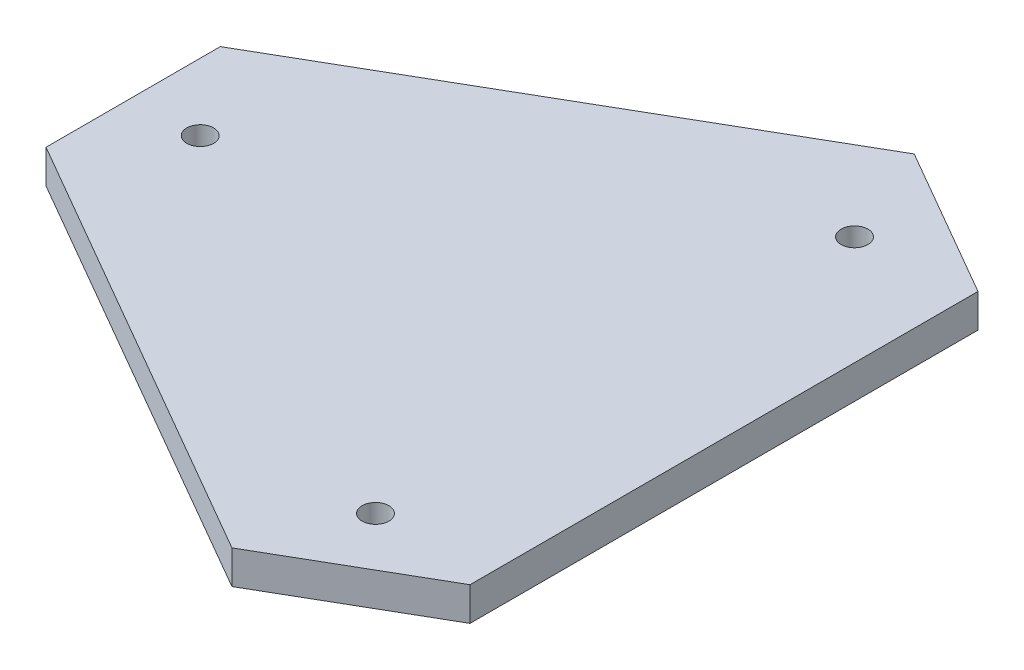
ISO-10303-21;
HEADER;
FILE_DESCRIPTION(('STEP AP214'),'2;1');
FILE_NAME('part.step','',(''),(''),'','','');
FILE_SCHEMA(('AUTOMOTIVE_DESIGN { 1 0 10303 214 1 1 1 1 }'));
ENDSEC;
DATA;
#1=APPLICATION_CONTEXT('core data for automotive mechanical design processes');
#2=APPLICATION_PROTOCOL_DEFINITION('international standard','automotive_design',2000,#1);
#3=PRODUCT_CONTEXT('',#1,'mechanical');
#4=PRODUCT('Part','Part','',(#3));
#5=PRODUCT_RELATED_PRODUCT_CATEGORY('part','',(#4));
#6=PRODUCT_DEFINITION_FORMATION('','',#4);
#7=PRODUCT_DEFINITION_CONTEXT('part definition',#1,'design');
#8=PRODUCT_DEFINITION('design','',#6,#7);
#9=PRODUCT_DEFINITION_SHAPE('','',#8);
#10=(LENGTH_UNIT() NAMED_UNIT(*) SI_UNIT(.MILLI.,.METRE.));
#11=(NAMED_UNIT(*) PLANE_ANGLE_UNIT() SI_UNIT($,.RADIAN.));
#12=(NAMED_UNIT(*) SI_UNIT($,.STERADIAN.) SOLID_ANGLE_UNIT());
#13=UNCERTAINTY_MEASURE_WITH_UNIT(LENGTH_MEASURE(1.E-05),#10,'distance_accuracy_value','');
#14=(GEOMETRIC_REPRESENTATION_CONTEXT(3) GLOBAL_UNCERTAINTY_ASSIGNED_CONTEXT((#13)) GLOBAL_UNIT_ASSIGNED_CONTEXT((#10,
#11,#12)) REPRESENTATION_CONTEXT('',''));
#15=CARTESIAN_POINT('',(0.,0.,0.));
#16=DIRECTION('',(0.,0.,1.));
#17=DIRECTION('',(1.,0.,0.));
#18=AXIS2_PLACEMENT_3D('',#15,#16,#17);
#19=CARTESIAN_POINT('',(-18.44216054185,5.,31.9427590598262));
#20=DIRECTION('',(-0.5,0.,0.866025403784439));
#21=DIRECTION('',(0.866025403784439,0.,0.5));
#22=AXIS2_PLACEMENT_3D('',#19,#20,#21);
#23=PLANE('',#22);
#24=DIRECTION('',(-0.866025403784439,0.,-0.5));
#25=VECTOR('',#24,1.);
#26=CARTESIAN_POINT('',(-18.44216054185,0.,31.9427590598262));
#27=LINE('',#26,#25);
#28=CARTESIAN_POINT('',(14.3676605853047,0.,50.8855181196525));
#29=VERTEX_POINT('',#28);
#30=CARTESIAN_POINT('',(-51.2519816690048,0.,13.));
#31=VERTEX_POINT('',#30);
#32=EDGE_CURVE('E142',#29,#31,#27,.T.);
#33=ORIENTED_EDGE('',*,*,#32,.F.);
#34=DIRECTION('',(0.,-1.,0.));
#35=VECTOR('',#34,1.);
#36=CARTESIAN_POINT('',(14.3676605853047,5.,50.8855181196525));
#37=LINE('',#36,#35);
#38=CARTESIAN_POINT('',(14.3676605853047,5.,50.8855181196525));
#39=VERTEX_POINT('',#38);
#40=EDGE_CURVE('E11',#39,#29,#37,.T.);
#41=ORIENTED_EDGE('',*,*,#40,.F.);
#42=DIRECTION('',(-0.866025403784439,0.,-0.5));
#43=VECTOR('',#42,1.);
#44=CARTESIAN_POINT('',(-18.44216054185,5.,31.9427590598262));
#45=LINE('',#44,#43);
#46=CARTESIAN_POINT('',(-51.2519816690048,5.,13.));
#47=VERTEX_POINT('',#46);
#48=EDGE_CURVE('E312',#39,#47,#45,.T.);
#49=ORIENTED_EDGE('',*,*,#48,.T.);
#50=DIRECTION('',(0.,-1.,0.));
#51=VECTOR('',#50,1.);
#52=CARTESIAN_POINT('',(-51.2519816690048,5.,13.));
#53=LINE('',#52,#51);
#54=EDGE_CURVE('E61',#47,#31,#53,.T.);
#55=ORIENTED_EDGE('',*,*,#54,.T.);
#56=EDGE_LOOP('',(#33,#41,#49,#55));
#57=FACE_BOUND('',#56,.T.);
#58=ADVANCED_FACE('F43',(#57),#23,.T.);
#59=CARTESIAN_POINT('',(25.6259908345024,5.,44.3855181196525));
#60=DIRECTION('',(0.5,0.,0.866025403784439));
#61=DIRECTION('',(0.866025403784439,0.,-0.5));
#62=AXIS2_PLACEMENT_3D('',#59,#60,#61);
#63=PLANE('',#62);
#64=DIRECTION('',(-0.866025403784439,0.,0.5));
#65=VECTOR('',#64,1.);
#66=CARTESIAN_POINT('',(25.6259908345024,0.,44.3855181196525));
#67=LINE('',#66,#65);
#68=CARTESIAN_POINT('',(36.8843210837001,0.,37.8855181196525));
#69=VERTEX_POINT('',#68);
#70=EDGE_CURVE('E145',#69,#29,#67,.T.);
#71=ORIENTED_EDGE('',*,*,#70,.F.);
#72=DIRECTION('',(0.,-1.,0.));
#73=VECTOR('',#72,1.);
#74=CARTESIAN_POINT('',(36.8843210837001,5.,37.8855181196525));
#75=LINE('',#74,#73);
#76=CARTESIAN_POINT('',(36.8843210837001,5.,37.8855181196525));
#77=VERTEX_POINT('',#76);
#78=EDGE_CURVE('E53',#77,#69,#75,.T.);
#79=ORIENTED_EDGE('',*,*,#78,.F.);
#80=DIRECTION('',(-0.866025403784439,0.,0.5));
#81=VECTOR('',#80,1.);
#82=CARTESIAN_POINT('',(25.6259908345024,5.,44.3855181196525));
#83=LINE('',#82,#81);
#84=EDGE_CURVE('E319',#77,#39,#83,.T.);
#85=ORIENTED_EDGE('',*,*,#84,.T.);
#86=ORIENTED_EDGE('',*,*,#40,.T.);
#87=EDGE_LOOP('',(#71,#79,#85,#86));
#88=FACE_BOUND('',#87,.T.);
#89=ADVANCED_FACE('F175',(#88),#63,.T.);
#90=CARTESIAN_POINT('',(36.8843210837001,5.,0.));
#91=DIRECTION('',(1.,0.,0.));
#92=DIRECTION('',(0.,0.,-1.));
#93=AXIS2_PLACEMENT_3D('',#90,#91,#92);
#94=PLANE('',#93);
#95=DIRECTION('',(0.,0.,1.));
#96=VECTOR('',#95,1.);
#97=CARTESIAN_POINT('',(36.8843210837001,0.,0.));
#98=LINE('',#97,#96);
#99=CARTESIAN_POINT('',(36.8843210837001,0.,-37.8855181196525));
#100=VERTEX_POINT('',#99);
#101=EDGE_CURVE('E149',#100,#69,#98,.T.);
#102=ORIENTED_EDGE('',*,*,#101,.F.);
#103=DIRECTION('',(0.,-1.,0.));
#104=VECTOR('',#103,1.);
#105=CARTESIAN_POINT('',(36.8843210837001,5.,-37.8855181196525));
#106=LINE('',#105,#104);
#107=CARTESIAN_POINT('',(36.8843210837001,5.,-37.8855181196525));
#108=VERTEX_POINT('',#107);
#109=EDGE_CURVE('E109',#108,#100,#106,.T.);
#110=ORIENTED_EDGE('',*,*,#109,.F.);
#111=DIRECTION('',(0.,0.,1.));
#112=VECTOR('',#111,1.);
#113=CARTESIAN_POINT('',(36.8843210837001,5.,0.));
#114=LINE('',#113,#112);
#115=EDGE_CURVE('E119',#108,#77,#114,.T.);
#116=ORIENTED_EDGE('',*,*,#115,.T.);
#117=ORIENTED_EDGE('',*,*,#78,.T.);
#118=EDGE_LOOP('',(#102,#110,#116,#117));
#119=FACE_BOUND('',#118,.T.);
#120=ADVANCED_FACE('F172',(#119),#94,.T.);
#121=CARTESIAN_POINT('',(25.6259908345023,5.,-44.3855181196525));
#122=DIRECTION('',(0.499999999999999,0.,-0.866025403784439));
#123=DIRECTION('',(-0.866025403784439,0.,-0.499999999999999));
#124=AXIS2_PLACEMENT_3D('',#121,#122,#123);
#125=PLANE('',#124);
#126=DIRECTION('',(0.866025403784439,0.,0.499999999999999));
#127=VECTOR('',#126,1.);
#128=CARTESIAN_POINT('',(25.6259908345023,0.,-44.3855181196525));
#129=LINE('',#128,#127);
#130=CARTESIAN_POINT('',(14.3676605853047,0.,-50.8855181196525));
#131=VERTEX_POINT('',#130);
#132=EDGE_CURVE('E104',#131,#100,#129,.T.);
#133=ORIENTED_EDGE('',*,*,#132,.F.);
#134=DIRECTION('',(0.,-1.,0.));
#135=VECTOR('',#134,1.);
#136=CARTESIAN_POINT('',(14.3676605853047,5.,-50.8855181196525));
#137=LINE('',#136,#135);
#138=CARTESIAN_POINT('',(14.3676605853047,5.,-50.8855181196525));
#139=VERTEX_POINT('',#138);
#140=EDGE_CURVE('E99',#139,#131,#137,.T.);
#141=ORIENTED_EDGE('',*,*,#140,.F.);
#142=DIRECTION('',(0.866025403784439,0.,0.499999999999999));
#143=VECTOR('',#142,1.);
#144=CARTESIAN_POINT('',(25.6259908345023,5.,-44.3855181196525));
#145=LINE('',#144,#143);
#146=EDGE_CURVE('E102',#139,#108,#145,.T.);
#147=ORIENTED_EDGE('',*,*,#146,.T.);
#148=ORIENTED_EDGE('',*,*,#109,.T.);
#149=EDGE_LOOP('',(#133,#141,#147,#148));
#150=FACE_BOUND('',#149,.T.);
#151=ADVANCED_FACE('F101',(#150),#125,.T.);
#152=CARTESIAN_POINT('',(-18.4421605418501,5.,-31.9427590598262));
#153=DIRECTION('',(-0.5,0.,-0.866025403784438));
#154=DIRECTION('',(-0.866025403784439,0.,0.5));
#155=AXIS2_PLACEMENT_3D('',#152,#153,#154);
#156=PLANE('',#155);
#157=DIRECTION('',(0.866025403784439,0.,-0.5));
#158=VECTOR('',#157,1.);
#159=CARTESIAN_POINT('',(-18.4421605418501,0.,-31.9427590598262));
#160=LINE('',#159,#158);
#161=CARTESIAN_POINT('',(-51.2519816690048,0.,-13.));
#162=VERTEX_POINT('',#161);
#163=EDGE_CURVE('E155',#162,#131,#160,.T.);
#164=ORIENTED_EDGE('',*,*,#163,.F.);
#165=DIRECTION('',(0.,-1.,0.));
#166=VECTOR('',#165,1.);
#167=CARTESIAN_POINT('',(-51.2519816690048,5.,-13.));
#168=LINE('',#167,#166);
#169=CARTESIAN_POINT('',(-51.2519816690048,5.,-13.));
#170=VERTEX_POINT('',#169);
#171=EDGE_CURVE('E80',#170,#162,#168,.T.);
#172=ORIENTED_EDGE('',*,*,#171,.F.);
#173=DIRECTION('',(0.866025403784439,0.,-0.5));
#174=VECTOR('',#173,1.);
#175=CARTESIAN_POINT('',(-18.4421605418501,5.,-31.9427590598262));
#176=LINE('',#175,#174);
#177=EDGE_CURVE('E116',#170,#139,#176,.T.);
#178=ORIENTED_EDGE('',*,*,#177,.T.);
#179=ORIENTED_EDGE('',*,*,#140,.T.);
#180=EDGE_LOOP('',(#164,#172,#178,#179));
#181=FACE_BOUND('',#180,.T.);
#182=ADVANCED_FACE('F122',(#181),#156,.T.);
#183=CARTESIAN_POINT('',(-41.2519816690048,5.,0.));
#184=DIRECTION('',(0.,-1.,0.));
#185=DIRECTION('',(0.,0.,-1.));
#186=AXIS2_PLACEMENT_3D('',#183,#184,#185);
#187=CYLINDRICAL_SURFACE('',#186,2.);
#188=CARTESIAN_POINT('',(-41.2519816690048,5.,0.));
#189=DIRECTION('',(0.,1.,0.));
#190=DIRECTION('',(0.,0.,1.));
#191=AXIS2_PLACEMENT_3D('',#188,#189,#190);
#192=CIRCLE('',#191,2.);
#193=CARTESIAN_POINT('',(-41.2519816690048,5.,2.));
#194=VERTEX_POINT('',#193);
#195=EDGE_CURVE('E307',#194,#194,#192,.T.);
#196=ORIENTED_EDGE('',*,*,#195,.T.);
#197=EDGE_LOOP('',(#196));
#198=FACE_BOUND('',#197,.T.);
#199=CARTESIAN_POINT('',(-41.2519816690048,0.,0.));
#200=DIRECTION('',(0.,1.,0.));
#201=DIRECTION('',(0.,0.,1.));
#202=AXIS2_PLACEMENT_3D('',#199,#200,#201);
#203=CIRCLE('',#202,2.);
#204=CARTESIAN_POINT('',(-41.2519816690048,0.,2.));
#205=VERTEX_POINT('',#204);
#206=EDGE_CURVE('E138',#205,#205,#203,.T.);
#207=ORIENTED_EDGE('',*,*,#206,.F.);
#208=EDGE_LOOP('',(#207));
#209=FACE_BOUND('',#208,.T.);
#210=ADVANCED_FACE('F199',(#198,#209),#187,.F.);
#211=CARTESIAN_POINT('',(20.6259908345026,5.,-35.725264081808));
#212=DIRECTION('',(0.,-1.,0.));
#213=DIRECTION('',(0.,0.,-1.));
#214=AXIS2_PLACEMENT_3D('',#211,#212,#213);
#215=CYLINDRICAL_SURFACE('',#214,2.);
#216=CARTESIAN_POINT('',(20.6259908345026,5.,-35.725264081808));
#217=DIRECTION('',(0.,1.,0.));
#218=DIRECTION('',(0.,0.,1.));
#219=AXIS2_PLACEMENT_3D('',#216,#217,#218);
#220=CIRCLE('',#219,2.);
#221=CARTESIAN_POINT('',(20.6259908345026,5.,-33.725264081808));
#222=VERTEX_POINT('',#221);
#223=EDGE_CURVE('E209',#222,#222,#220,.T.);
#224=ORIENTED_EDGE('',*,*,#223,.T.);
#225=EDGE_LOOP('',(#224));
#226=FACE_BOUND('',#225,.T.);
#227=CARTESIAN_POINT('',(20.6259908345026,0.,-35.725264081808));
#228=DIRECTION('',(0.,1.,0.));
#229=DIRECTION('',(0.,0.,1.));
#230=AXIS2_PLACEMENT_3D('',#227,#228,#229);
#231=CIRCLE('',#230,2.);
#232=CARTESIAN_POINT('',(20.6259908345026,0.,-33.725264081808));
#233=VERTEX_POINT('',#232);
#234=EDGE_CURVE('E134',#233,#233,#231,.T.);
#235=ORIENTED_EDGE('',*,*,#234,.F.);
#236=EDGE_LOOP('',(#235));
#237=FACE_BOUND('',#236,.T.);
#238=ADVANCED_FACE('F187',(#226,#237),#215,.F.);
#239=CARTESIAN_POINT('',(20.625990834502,5.,35.7252640818083));
#240=DIRECTION('',(0.,-1.,0.));
#241=DIRECTION('',(0.,0.,-1.));
#242=AXIS2_PLACEMENT_3D('',#239,#240,#241);
#243=CYLINDRICAL_SURFACE('',#242,2.);
#244=CARTESIAN_POINT('',(20.625990834502,5.,35.7252640818083));
#245=DIRECTION('',(0.,1.,0.));
#246=DIRECTION('',(0.,0.,1.));
#247=AXIS2_PLACEMENT_3D('',#244,#245,#246);
#248=CIRCLE('',#247,2.);
#249=CARTESIAN_POINT('',(20.625990834502,5.,37.7252640818083));
#250=VERTEX_POINT('',#249);
#251=EDGE_CURVE('E162',#250,#250,#248,.T.);
#252=ORIENTED_EDGE('',*,*,#251,.T.);
#253=EDGE_LOOP('',(#252));
#254=FACE_BOUND('',#253,.T.);
#255=CARTESIAN_POINT('',(20.625990834502,0.,35.7252640818083));
#256=DIRECTION('',(0.,1.,0.));
#257=DIRECTION('',(0.,0.,1.));
#258=AXIS2_PLACEMENT_3D('',#255,#256,#257);
#259=CIRCLE('',#258,2.);
#260=CARTESIAN_POINT('',(20.625990834502,0.,37.7252640818083));
#261=VERTEX_POINT('',#260);
#262=EDGE_CURVE('E130',#261,#261,#259,.T.);
#263=ORIENTED_EDGE('',*,*,#262,.F.);
#264=EDGE_LOOP('',(#263));
#265=FACE_BOUND('',#264,.T.);
#266=ADVANCED_FACE('F45',(#254,#265),#243,.F.);
#267=CARTESIAN_POINT('',(-51.2519816690048,5.,0.));
#268=DIRECTION('',(-1.,0.,0.));
#269=DIRECTION('',(0.,0.,1.));
#270=AXIS2_PLACEMENT_3D('',#267,#268,#269);
#271=PLANE('',#270);
#272=DIRECTION('',(0.,0.,-1.));
#273=VECTOR('',#272,1.);
#274=CARTESIAN_POINT('',(-51.2519816690048,0.,0.));
#275=LINE('',#274,#273);
#276=EDGE_CURVE('E158',#31,#162,#275,.T.);
#277=ORIENTED_EDGE('',*,*,#276,.F.);
#278=ORIENTED_EDGE('',*,*,#54,.F.);
#279=DIRECTION('',(0.,0.,-1.));
#280=VECTOR('',#279,1.);
#281=CARTESIAN_POINT('',(-51.2519816690048,5.,0.));
#282=LINE('',#281,#280);
#283=EDGE_CURVE('E124',#47,#170,#282,.T.);
#284=ORIENTED_EDGE('',*,*,#283,.T.);
#285=ORIENTED_EDGE('',*,*,#171,.T.);
#286=EDGE_LOOP('',(#277,#278,#284,#285));
#287=FACE_BOUND('',#286,.T.);
#288=ADVANCED_FACE('F178',(#287),#271,.T.);
#289=CARTESIAN_POINT('',(0.,5.,0.));
#290=DIRECTION('',(0.,1.,0.));
#291=DIRECTION('',(0.,0.,1.));
#292=AXIS2_PLACEMENT_3D('',#289,#290,#291);
#293=PLANE('',#292);
#294=ORIENTED_EDGE('',*,*,#251,.F.);
#295=EDGE_LOOP('',(#294));
#296=FACE_BOUND('',#295,.T.);
#297=ORIENTED_EDGE('',*,*,#223,.F.);
#298=EDGE_LOOP('',(#297));
#299=FACE_BOUND('',#298,.T.);
#300=ORIENTED_EDGE('',*,*,#195,.F.);
#301=EDGE_LOOP('',(#300));
#302=FACE_BOUND('',#301,.T.);
#303=ORIENTED_EDGE('',*,*,#48,.F.);
#304=ORIENTED_EDGE('',*,*,#84,.F.);
#305=ORIENTED_EDGE('',*,*,#115,.F.);
#306=ORIENTED_EDGE('',*,*,#146,.F.);
#307=ORIENTED_EDGE('',*,*,#177,.F.);
#308=ORIENTED_EDGE('',*,*,#283,.F.);
#309=EDGE_LOOP('',(#303,#304,#305,#306,#307,#308));
#310=FACE_BOUND('',#309,.T.);
#311=ADVANCED_FACE('F114',(#296,#299,#302,#310),#293,.T.);
#312=CARTESIAN_POINT('',(0.,0.,0.));
#313=DIRECTION('',(0.,1.,0.));
#314=DIRECTION('',(0.,0.,1.));
#315=AXIS2_PLACEMENT_3D('',#312,#313,#314);
#316=PLANE('',#315);
#317=ORIENTED_EDGE('',*,*,#262,.T.);
#318=EDGE_LOOP('',(#317));
#319=FACE_BOUND('',#318,.T.);
#320=ORIENTED_EDGE('',*,*,#234,.T.);
#321=EDGE_LOOP('',(#320));
#322=FACE_BOUND('',#321,.T.);
#323=ORIENTED_EDGE('',*,*,#206,.T.);
#324=EDGE_LOOP('',(#323));
#325=FACE_BOUND('',#324,.T.);
#326=ORIENTED_EDGE('',*,*,#32,.T.);
#327=ORIENTED_EDGE('',*,*,#276,.T.);
#328=ORIENTED_EDGE('',*,*,#163,.T.);
#329=ORIENTED_EDGE('',*,*,#132,.T.);
#330=ORIENTED_EDGE('',*,*,#101,.T.);
#331=ORIENTED_EDGE('',*,*,#70,.T.);
#332=EDGE_LOOP('',(#326,#327,#328,#329,#330,#331));
#333=FACE_BOUND('',#332,.T.);
#334=ADVANCED_FACE('F177',(#319,#322,#325,#333),#316,.F.);
#335=CLOSED_SHELL('',(#58,#89,#120,#151,#182,#210,#238,#266,#288,#311,#334));
#336=MANIFOLD_SOLID_BREP('B2',#335);
#337=ADVANCED_BREP_SHAPE_REPRESENTATION('',(#18,#336),#14);
#338=SHAPE_DEFINITION_REPRESENTATION(#9,#337);
ENDSEC;
END-ISO-10303-21;
